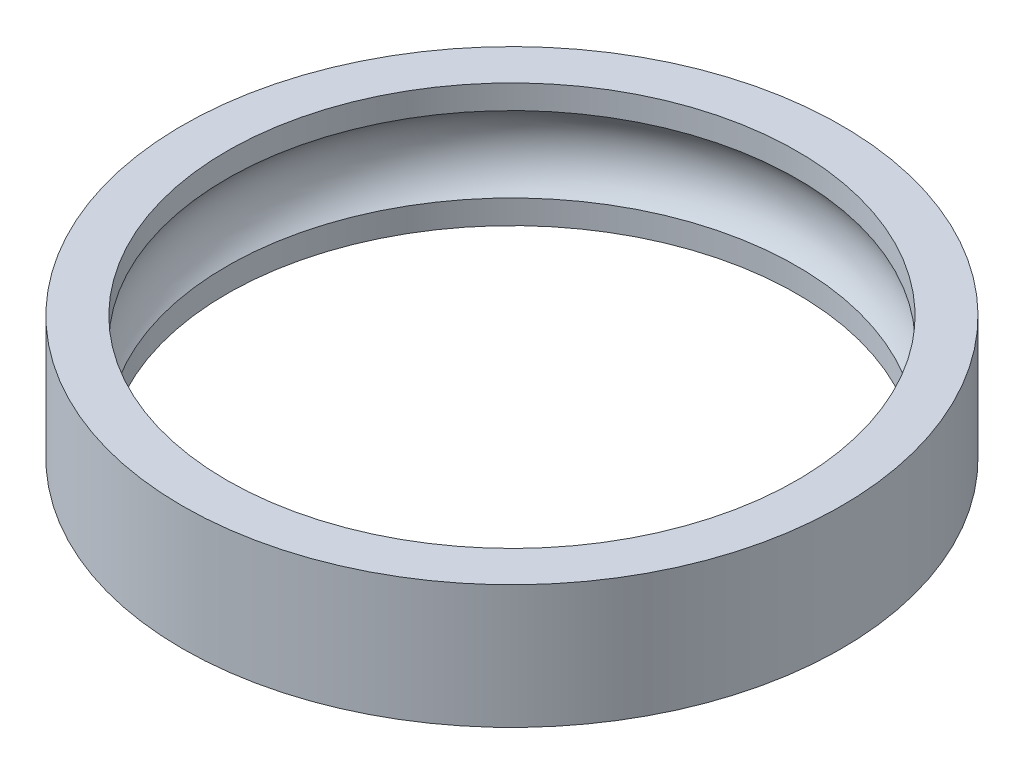
ISO-10303-21;
HEADER;
FILE_DESCRIPTION(('STEP AP214'),'2;1');
FILE_NAME('part.step','',(''),(''),'','','');
FILE_SCHEMA(('AUTOMOTIVE_DESIGN { 1 0 10303 214 1 1 1 1 }'));
ENDSEC;
DATA;
#1=APPLICATION_CONTEXT('core data for automotive mechanical design processes');
#2=APPLICATION_PROTOCOL_DEFINITION('international standard','automotive_design',2000,#1);
#3=PRODUCT_CONTEXT('',#1,'mechanical');
#4=PRODUCT('Part','Part','',(#3));
#5=PRODUCT_RELATED_PRODUCT_CATEGORY('part','',(#4));
#6=PRODUCT_DEFINITION_FORMATION('','',#4);
#7=PRODUCT_DEFINITION_CONTEXT('part definition',#1,'design');
#8=PRODUCT_DEFINITION('design','',#6,#7);
#9=PRODUCT_DEFINITION_SHAPE('','',#8);
#10=(LENGTH_UNIT() NAMED_UNIT(*) SI_UNIT(.MILLI.,.METRE.));
#11=(NAMED_UNIT(*) PLANE_ANGLE_UNIT() SI_UNIT($,.RADIAN.));
#12=(NAMED_UNIT(*) SI_UNIT($,.STERADIAN.) SOLID_ANGLE_UNIT());
#13=UNCERTAINTY_MEASURE_WITH_UNIT(LENGTH_MEASURE(1.E-05),#10,'distance_accuracy_value','');
#14=(GEOMETRIC_REPRESENTATION_CONTEXT(3) GLOBAL_UNCERTAINTY_ASSIGNED_CONTEXT((#13)) GLOBAL_UNIT_ASSIGNED_CONTEXT((#10,
#11,#12)) REPRESENTATION_CONTEXT('',''));
#15=CARTESIAN_POINT('',(0.,0.,0.));
#16=DIRECTION('',(0.,0.,1.));
#17=DIRECTION('',(1.,0.,0.));
#18=AXIS2_PLACEMENT_3D('',#15,#16,#17);
#19=CARTESIAN_POINT('',(0.,7.5,0.));
#20=DIRECTION('',(0.,-1.,0.));
#21=DIRECTION('',(0.,0.,-1.));
#22=AXIS2_PLACEMENT_3D('',#19,#20,#21);
#23=CYLINDRICAL_SURFACE('',#22,34.6);
#24=CARTESIAN_POINT('',(0.,4.59238500128199,0.));
#25=DIRECTION('',(0.,-1.,0.));
#26=DIRECTION('',(0.,0.,-1.));
#27=AXIS2_PLACEMENT_3D('',#24,#25,#26);
#28=CIRCLE('',#27,34.6);
#29=CARTESIAN_POINT('',(0.,4.59238500128199,34.6));
#30=VERTEX_POINT('',#29);
#31=EDGE_CURVE('E11',#30,#30,#28,.F.);
#32=ORIENTED_EDGE('',*,*,#31,.F.);
#33=EDGE_LOOP('',(#32));
#34=FACE_BOUND('',#33,.T.);
#35=CARTESIAN_POINT('',(0.,7.5,0.));
#36=DIRECTION('',(0.,1.,0.));
#37=DIRECTION('',(0.,0.,1.));
#38=AXIS2_PLACEMENT_3D('',#35,#36,#37);
#39=CIRCLE('',#38,34.6);
#40=CARTESIAN_POINT('',(0.,7.5,34.6));
#41=VERTEX_POINT('',#40);
#42=EDGE_CURVE('E66',#41,#41,#39,.T.);
#43=ORIENTED_EDGE('',*,*,#42,.T.);
#44=EDGE_LOOP('',(#43));
#45=FACE_BOUND('',#44,.T.);
#46=ADVANCED_FACE('F42',(#34,#45),#23,.F.);
#47=CARTESIAN_POINT('',(0.,7.5,0.));
#48=DIRECTION('',(0.,1.,0.));
#49=DIRECTION('',(0.,0.,1.));
#50=AXIS2_PLACEMENT_3D('',#47,#48,#49);
#51=PLANE('',#50);
#52=CARTESIAN_POINT('',(0.,7.5,0.));
#53=DIRECTION('',(0.,1.,0.));
#54=DIRECTION('',(0.,0.,1.));
#55=AXIS2_PLACEMENT_3D('',#52,#53,#54);
#56=CIRCLE('',#55,40.);
#57=CARTESIAN_POINT('',(0.,7.5,40.));
#58=VERTEX_POINT('',#57);
#59=EDGE_CURVE('E73',#58,#58,#56,.T.);
#60=ORIENTED_EDGE('',*,*,#59,.T.);
#61=EDGE_LOOP('',(#60));
#62=FACE_BOUND('',#61,.T.);
#63=ORIENTED_EDGE('',*,*,#42,.F.);
#64=EDGE_LOOP('',(#63));
#65=FACE_BOUND('',#64,.T.);
#66=ADVANCED_FACE('F86',(#62,#65),#51,.T.);
#67=CARTESIAN_POINT('',(0.,-7.5,0.));
#68=DIRECTION('',(0.,1.,0.));
#69=DIRECTION('',(0.,0.,1.));
#70=AXIS2_PLACEMENT_3D('',#67,#68,#69);
#71=PLANE('',#70);
#72=CARTESIAN_POINT('',(0.,-7.5,0.));
#73=DIRECTION('',(0.,1.,0.));
#74=DIRECTION('',(0.,0.,1.));
#75=AXIS2_PLACEMENT_3D('',#72,#73,#74);
#76=CIRCLE('',#75,40.);
#77=CARTESIAN_POINT('',(0.,-7.5,40.));
#78=VERTEX_POINT('',#77);
#79=EDGE_CURVE('E71',#78,#78,#76,.T.);
#80=ORIENTED_EDGE('',*,*,#79,.F.);
#81=EDGE_LOOP('',(#80));
#82=FACE_BOUND('',#81,.T.);
#83=CARTESIAN_POINT('',(0.,-7.5,0.));
#84=DIRECTION('',(0.,1.,0.));
#85=DIRECTION('',(0.,0.,1.));
#86=AXIS2_PLACEMENT_3D('',#83,#84,#85);
#87=CIRCLE('',#86,34.6);
#88=CARTESIAN_POINT('',(0.,-7.5,34.6));
#89=VERTEX_POINT('',#88);
#90=EDGE_CURVE('E62',#89,#89,#87,.T.);
#91=ORIENTED_EDGE('',*,*,#90,.T.);
#92=EDGE_LOOP('',(#91));
#93=FACE_BOUND('',#92,.T.);
#94=ADVANCED_FACE('F83',(#82,#93),#71,.F.);
#95=CARTESIAN_POINT('',(0.,7.5,0.));
#96=DIRECTION('',(0.,-1.,0.));
#97=DIRECTION('',(0.,0.,-1.));
#98=AXIS2_PLACEMENT_3D('',#95,#96,#97);
#99=CYLINDRICAL_SURFACE('',#98,40.);
#100=ORIENTED_EDGE('',*,*,#59,.F.);
#101=EDGE_LOOP('',(#100));
#102=FACE_BOUND('',#101,.T.);
#103=ORIENTED_EDGE('',*,*,#79,.T.);
#104=EDGE_LOOP('',(#103));
#105=FACE_BOUND('',#104,.T.);
#106=ADVANCED_FACE('F44',(#102,#105),#99,.T.);
#107=CARTESIAN_POINT('',(0.,-4.59238500128204,0.));
#108=DIRECTION('',(0.,1.,0.));
#109=DIRECTION('',(0.,0.,1.));
#110=AXIS2_PLACEMENT_3D('',#107,#108,#109);
#111=CIRCLE('',#110,34.6);
#112=CARTESIAN_POINT('',(0.,-4.59238500128204,34.6));
#113=VERTEX_POINT('',#112);
#114=EDGE_CURVE('E51',#113,#113,#111,.F.);
#115=ORIENTED_EDGE('',*,*,#114,.F.);
#116=EDGE_LOOP('',(#115));
#117=FACE_BOUND('',#116,.T.);
#118=ORIENTED_EDGE('',*,*,#90,.F.);
#119=EDGE_LOOP('',(#118));
#120=FACE_BOUND('',#119,.T.);
#121=ADVANCED_FACE('F89',(#117,#120),#23,.F.);
#122=CARTESIAN_POINT('',(0.,0.,0.));
#123=DIRECTION('',(0.,1.,0.));
#124=DIRECTION('',(0.,0.,1.));
#125=AXIS2_PLACEMENT_3D('',#122,#123,#124);
#126=TOROIDAL_SURFACE('',#125,30.,6.50000000000001);
#127=ORIENTED_EDGE('',*,*,#31,.T.);
#128=CARTESIAN_POINT('',(0.,0.,30.));
#129=DIRECTION('',(1.,0.,0.));
#130=DIRECTION('',(0.,0.,-1.));
#131=AXIS2_PLACEMENT_3D('',#128,#129,#130);
#132=CIRCLE('',#131,6.50000000000001);
#133=EDGE_CURVE('E57',#30,#113,#132,.T.);
#134=ORIENTED_EDGE('',*,*,#133,.T.);
#135=ORIENTED_EDGE('',*,*,#114,.T.);
#136=ORIENTED_EDGE('',*,*,#133,.F.);
#137=EDGE_LOOP('',(#127,#134,#135,#136));
#138=FACE_BOUND('',#137,.T.);
#139=ADVANCED_FACE('F58',(#138),#126,.F.);
#140=CLOSED_SHELL('',(#46,#66,#94,#106,#121,#139));
#141=MANIFOLD_SOLID_BREP('B2',#140);
#142=ADVANCED_BREP_SHAPE_REPRESENTATION('',(#18,#141),#14);
#143=SHAPE_DEFINITION_REPRESENTATION(#9,#142);
ENDSEC;
END-ISO-10303-21;
